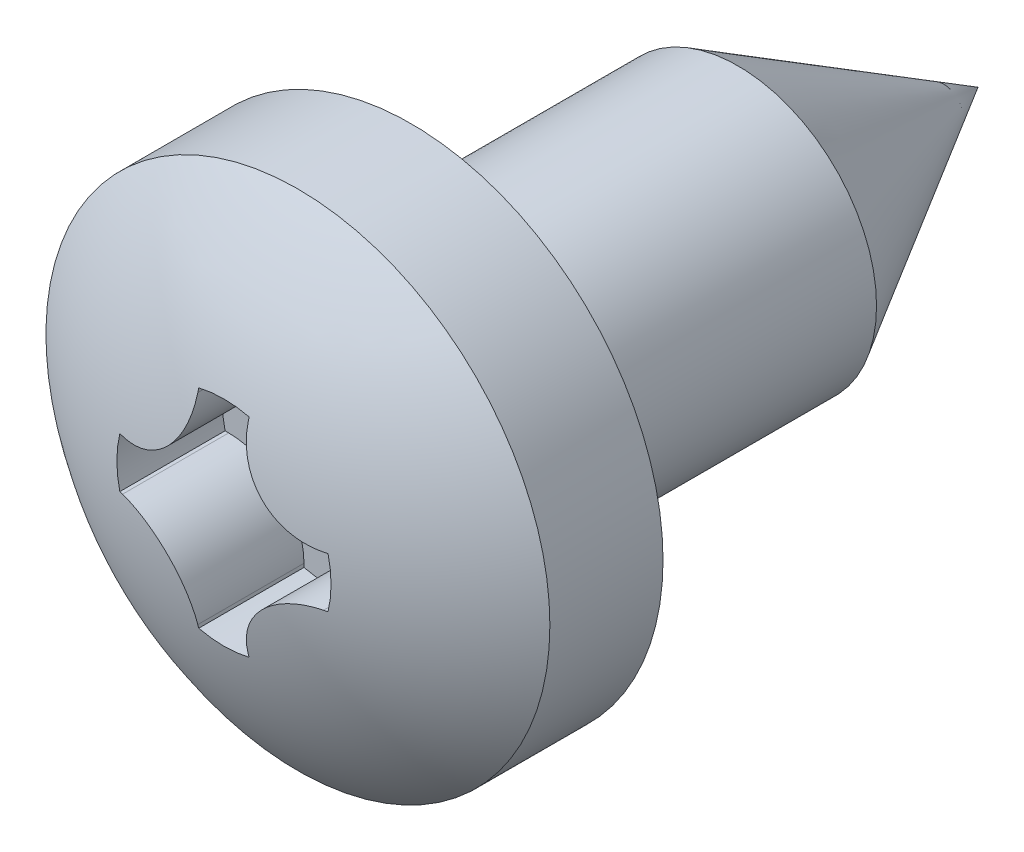
ISO-10303-21;
HEADER;
FILE_DESCRIPTION(('STEP AP214'),'2;1');
FILE_NAME('part.step','',(''),(''),'','','');
FILE_SCHEMA(('AUTOMOTIVE_DESIGN { 1 0 10303 214 1 1 1 1 }'));
ENDSEC;
DATA;
#1=APPLICATION_CONTEXT('core data for automotive mechanical design processes');
#2=APPLICATION_PROTOCOL_DEFINITION('international standard','automotive_design',2000,#1);
#3=PRODUCT_CONTEXT('',#1,'mechanical');
#4=PRODUCT('Part','Part','',(#3));
#5=PRODUCT_RELATED_PRODUCT_CATEGORY('part','',(#4));
#6=PRODUCT_DEFINITION_FORMATION('','',#4);
#7=PRODUCT_DEFINITION_CONTEXT('part definition',#1,'design');
#8=PRODUCT_DEFINITION('design','',#6,#7);
#9=PRODUCT_DEFINITION_SHAPE('','',#8);
#10=(LENGTH_UNIT() NAMED_UNIT(*) SI_UNIT(.MILLI.,.METRE.));
#11=(NAMED_UNIT(*) PLANE_ANGLE_UNIT() SI_UNIT($,.RADIAN.));
#12=(NAMED_UNIT(*) SI_UNIT($,.STERADIAN.) SOLID_ANGLE_UNIT());
#13=UNCERTAINTY_MEASURE_WITH_UNIT(LENGTH_MEASURE(1.E-05),#10,'distance_accuracy_value','');
#14=(GEOMETRIC_REPRESENTATION_CONTEXT(3) GLOBAL_UNCERTAINTY_ASSIGNED_CONTEXT((#13)) GLOBAL_UNIT_ASSIGNED_CONTEXT((#10,
#11,#12)) REPRESENTATION_CONTEXT('',''));
#15=CARTESIAN_POINT('',(0.,0.,0.));
#16=DIRECTION('',(0.,0.,1.));
#17=DIRECTION('',(1.,0.,0.));
#18=AXIS2_PLACEMENT_3D('',#15,#16,#17);
#19=CARTESIAN_POINT('',(0.,0.,2.9));
#20=DIRECTION('',(0.,0.,1.));
#21=DIRECTION('',(0.,1.,0.));
#22=AXIS2_PLACEMENT_3D('',#19,#20,#21);
#23=SPHERICAL_SURFACE('',#22,3.2);
#24=CARTESIAN_POINT('',(0.,0.,5.39799919935936));
#25=DIRECTION('',(0.,0.,1.));
#26=DIRECTION('',(1.,0.,0.));
#27=AXIS2_PLACEMENT_3D('',#24,#25,#26);
#28=CIRCLE('',#27,2.);
#29=CARTESIAN_POINT('',(2.,0.,5.39799919935936));
#30=VERTEX_POINT('',#29);
#31=EDGE_CURVE('E190',#30,#30,#28,.T.);
#32=ORIENTED_EDGE('',*,*,#31,.T.);
#33=EDGE_LOOP('',(#32));
#34=FACE_BOUND('',#33,.T.);
#35=CARTESIAN_POINT('',(0.,0.,5.98504457018047));
#36=DIRECTION('',(0.,0.,-1.));
#37=DIRECTION('',(-1.,0.,0.));
#38=AXIS2_PLACEMENT_3D('',#35,#36,#37);
#39=CIRCLE('',#38,0.85);
#40=CARTESIAN_POINT('',(0.200000000000001,0.826135582092915,5.98504457018047));
#41=VERTEX_POINT('',#40);
#42=CARTESIAN_POINT('',(-0.199999999999999,0.826135582092915,5.98504457018047));
#43=VERTEX_POINT('',#42);
#44=EDGE_CURVE('E298',#41,#43,#39,.F.);
#45=ORIENTED_EDGE('',*,*,#44,.F.);
#46=CARTESIAN_POINT('',(0.199999999999995,0.,2.9));
#47=DIRECTION('',(-1.,0.,0.));
#48=DIRECTION('',(0.,-1.,0.));
#49=AXIS2_PLACEMENT_3D('',#46,#47,#48);
#50=CIRCLE('',#49,3.19374388453426);
#51=CARTESIAN_POINT('',(0.200000000000001,0.797500009462237,5.99257073240172));
#52=VERTEX_POINT('',#51);
#53=EDGE_CURVE('E176',#52,#41,#50,.T.);
#54=ORIENTED_EDGE('',*,*,#53,.F.);
#55=CARTESIAN_POINT('',(0.200000033472805,0.797700009462237,5.9925191481242));
#56=CARTESIAN_POINT('',(0.199958585943166,0.765584612577376,6.00081150693265));
#57=CARTESIAN_POINT('',(0.202567151381046,0.733275599423227,6.00843748519532));
#58=CARTESIAN_POINT('',(0.213049468721375,0.669163190503092,6.02216667890958));
#59=CARTESIAN_POINT('',(0.220928138605759,0.637360295445592,6.02826846469623));
#60=CARTESIAN_POINT('',(0.241934580052925,0.575160718571951,6.03875243084097));
#61=CARTESIAN_POINT('',(0.255071740839946,0.544766661186098,6.0431315073583));
#62=CARTESIAN_POINT('',(0.286291958936198,0.486428822054425,6.05000453295774));
#63=CARTESIAN_POINT('',(0.304370880784494,0.458483017221231,6.05250005173667));
#64=CARTESIAN_POINT('',(0.344333915217269,0.406755748257839,6.05547466759342));
#65=CARTESIAN_POINT('',(0.366078643749459,0.382870071363386,6.05601539962287));
#66=CARTESIAN_POINT('',(0.413114828149669,0.338926235328101,6.05523389232351));
#67=CARTESIAN_POINT('',(0.438406302053391,0.31886809565206,6.05391164352087));
#68=CARTESIAN_POINT('',(0.491337848312659,0.283428579732002,6.04948543959879));
#69=CARTESIAN_POINT('',(0.518933539669598,0.26797709060594,6.04641052005074));
#70=CARTESIAN_POINT('',(0.576026048301452,0.241672932796324,6.03859706761581));
#71=CARTESIAN_POINT('',(0.605523455084,0.230821698106915,6.03385801682534));
#72=CARTESIAN_POINT('',(0.662128765637274,0.214882325318074,6.02349118330749));
#73=CARTESIAN_POINT('',(0.689123366977149,0.209276438333222,6.01802737287753));
#74=CARTESIAN_POINT('',(0.743355328975026,0.201826686889872,6.00603874154387));
#75=CARTESIAN_POINT('',(0.770592289914182,0.199977484994576,5.99951544020863));
#76=CARTESIAN_POINT('',(0.797700009462238,0.200000033472804,5.9925191481242));
#77=B_SPLINE_CURVE_WITH_KNOTS('',3,(#55,#56,#57,#58,#59,#60,#61,#62,#63,#64,#65,#66,#67,#68,#69,
#70,#71,#72,#73,#74,#75,#76),.UNSPECIFIED.,.F.,.F.,(4,2,2,2,2,2,2,2,2,2,4),(0.,
0.0994256874660207,0.198944287163754,0.298641379250357,0.398255294950895,0.494699541070248,
0.591144277639977,0.686035864871707,0.780957010056294,0.865005724605283,0.948934940362168),.UNSPECIFIED.);
#78=CARTESIAN_POINT('',(0.797500009462238,0.2,5.99257073240172));
#79=VERTEX_POINT('',#78);
#80=EDGE_CURVE('E288',#52,#79,#77,.T.);
#81=ORIENTED_EDGE('',*,*,#80,.T.);
#82=CARTESIAN_POINT('',(0.,0.200000000000042,2.9));
#83=DIRECTION('',(0.,1.,0.));
#84=DIRECTION('',(-1.,0.,0.));
#85=AXIS2_PLACEMENT_3D('',#82,#83,#84);
#86=CIRCLE('',#85,3.19374388453426);
#87=CARTESIAN_POINT('',(0.826135582092917,0.199999999999999,5.98504457018047));
#88=VERTEX_POINT('',#87);
#89=EDGE_CURVE('E296',#79,#88,#86,.T.);
#90=ORIENTED_EDGE('',*,*,#89,.T.);
#91=CARTESIAN_POINT('',(0.,0.,5.98504457018047));
#92=DIRECTION('',(0.,0.,-1.));
#93=DIRECTION('',(-1.,0.,0.));
#94=AXIS2_PLACEMENT_3D('',#91,#92,#93);
#95=CIRCLE('',#94,0.850000000000002);
#96=CARTESIAN_POINT('',(0.826135582092917,-0.199999999999999,5.98504457018047));
#97=VERTEX_POINT('',#96);
#98=EDGE_CURVE('E371',#88,#97,#95,.T.);
#99=ORIENTED_EDGE('',*,*,#98,.T.);
#100=CARTESIAN_POINT('',(0.,-0.200000000000042,2.9));
#101=DIRECTION('',(0.,1.,0.));
#102=DIRECTION('',(-1.,0.,0.));
#103=AXIS2_PLACEMENT_3D('',#100,#101,#102);
#104=CIRCLE('',#103,3.19374388453426);
#105=CARTESIAN_POINT('',(0.797500009462238,-0.2,5.99257073240172));
#106=VERTEX_POINT('',#105);
#107=EDGE_CURVE('E260',#106,#97,#104,.T.);
#108=ORIENTED_EDGE('',*,*,#107,.F.);
#109=CARTESIAN_POINT('',(0.200000033472805,-0.797700009462237,5.9925191481242));
#110=CARTESIAN_POINT('',(0.199958585943166,-0.765584612577376,6.00081150693265));
#111=CARTESIAN_POINT('',(0.202567151381046,-0.733275599423227,6.00843748519532));
#112=CARTESIAN_POINT('',(0.213049468721375,-0.669163190503092,6.02216667890958));
#113=CARTESIAN_POINT('',(0.220928138605759,-0.637360295445592,6.02826846469623));
#114=CARTESIAN_POINT('',(0.241934580052925,-0.575160718571951,6.03875243084097));
#115=CARTESIAN_POINT('',(0.255071740839946,-0.544766661186098,6.0431315073583));
#116=CARTESIAN_POINT('',(0.286291958936198,-0.486428822054425,6.05000453295774));
#117=CARTESIAN_POINT('',(0.304370880784494,-0.458483017221231,6.05250005173667));
#118=CARTESIAN_POINT('',(0.344333915217269,-0.406755748257839,6.05547466759342));
#119=CARTESIAN_POINT('',(0.366078643749459,-0.382870071363386,6.05601539962287));
#120=CARTESIAN_POINT('',(0.413114828149669,-0.338926235328101,6.05523389232351));
#121=CARTESIAN_POINT('',(0.438406302053391,-0.31886809565206,6.05391164352087));
#122=CARTESIAN_POINT('',(0.491337848312659,-0.283428579732002,6.04948543959879));
#123=CARTESIAN_POINT('',(0.518933539669598,-0.26797709060594,6.04641052005074));
#124=CARTESIAN_POINT('',(0.576026048301452,-0.241672932796324,6.03859706761581));
#125=CARTESIAN_POINT('',(0.605523455084,-0.230821698106915,6.03385801682534));
#126=CARTESIAN_POINT('',(0.662128765637274,-0.214882325318074,6.02349118330749));
#127=CARTESIAN_POINT('',(0.689123366977148,-0.209276438333222,6.01802737287753));
#128=CARTESIAN_POINT('',(0.743355328975026,-0.201826686889872,6.00603874154387));
#129=CARTESIAN_POINT('',(0.770592289914182,-0.199977484994576,5.99951544020863));
#130=CARTESIAN_POINT('',(0.797700009462238,-0.200000033472804,5.9925191481242));
#131=B_SPLINE_CURVE_WITH_KNOTS('',3,(#109,#110,#111,#112,#113,#114,#115,#116,#117,#118,#119,
#120,#121,#122,#123,#124,#125,#126,#127,#128,#129,#130),.UNSPECIFIED.,.F.,.F.,(4,2,2,2,2,2,2,2,
2,2,4),(0.,0.0994256874660205,0.198944287163754,0.298641379250357,0.398255294950895,
0.494699541070248,0.591144277639977,0.686035864871707,0.780957010056294,0.865005724605282,
0.948934940362168),.UNSPECIFIED.);
#132=CARTESIAN_POINT('',(0.200000000000001,-0.797500009462237,5.99257073240172));
#133=VERTEX_POINT('',#132);
#134=EDGE_CURVE('E253',#133,#106,#131,.T.);
#135=ORIENTED_EDGE('',*,*,#134,.F.);
#136=CARTESIAN_POINT('',(0.199999999999995,0.,2.9));
#137=DIRECTION('',(1.,0.,0.));
#138=DIRECTION('',(0.,1.,0.));
#139=AXIS2_PLACEMENT_3D('',#136,#137,#138);
#140=CIRCLE('',#139,3.19374388453426);
#141=CARTESIAN_POINT('',(0.200000000000001,-0.826135582092915,5.98504457018047));
#142=VERTEX_POINT('',#141);
#143=EDGE_CURVE('E250',#133,#142,#140,.T.);
#144=ORIENTED_EDGE('',*,*,#143,.T.);
#145=CARTESIAN_POINT('',(0.,0.,5.98504457018047));
#146=DIRECTION('',(0.,0.,-1.));
#147=DIRECTION('',(-1.,0.,0.));
#148=AXIS2_PLACEMENT_3D('',#145,#146,#147);
#149=CIRCLE('',#148,0.85);
#150=CARTESIAN_POINT('',(-0.199999999999999,-0.826135582092915,5.98504457018047));
#151=VERTEX_POINT('',#150);
#152=EDGE_CURVE('E247',#142,#151,#149,.T.);
#153=ORIENTED_EDGE('',*,*,#152,.T.);
#154=CARTESIAN_POINT('',(-0.200000000000009,0.,2.9));
#155=DIRECTION('',(1.,0.,0.));
#156=DIRECTION('',(0.,1.,0.));
#157=AXIS2_PLACEMENT_3D('',#154,#155,#156);
#158=CIRCLE('',#157,3.19374388453426);
#159=CARTESIAN_POINT('',(-0.2,-0.797500009462236,5.99257073240172));
#160=VERTEX_POINT('',#159);
#161=EDGE_CURVE('E244',#160,#151,#158,.T.);
#162=ORIENTED_EDGE('',*,*,#161,.F.);
#163=CARTESIAN_POINT('',(-0.200000033472803,-0.797700009462236,5.9925191481242));
#164=CARTESIAN_POINT('',(-0.199958585943164,-0.765584612577375,6.00081150693265));
#165=CARTESIAN_POINT('',(-0.202567151381045,-0.733275599423226,6.00843748519532));
#166=CARTESIAN_POINT('',(-0.213049468721374,-0.669163190503091,6.02216667890959));
#167=CARTESIAN_POINT('',(-0.220928138605758,-0.637360295445591,6.02826846469623));
#168=CARTESIAN_POINT('',(-0.241934580052924,-0.57516071857195,6.03875243084097));
#169=CARTESIAN_POINT('',(-0.255071740839945,-0.544766661186096,6.0431315073583));
#170=CARTESIAN_POINT('',(-0.286291958936197,-0.486428822054424,6.05000453295774));
#171=CARTESIAN_POINT('',(-0.304370880784493,-0.45848301722123,6.05250005173667));
#172=CARTESIAN_POINT('',(-0.344333915217268,-0.406755748257838,6.05547466759342));
#173=CARTESIAN_POINT('',(-0.366078643749458,-0.382870071363384,6.05601539962287));
#174=CARTESIAN_POINT('',(-0.413114828149668,-0.3389262353281,6.05523389232351));
#175=CARTESIAN_POINT('',(-0.43840630205339,-0.318868095652059,6.05391164352087));
#176=CARTESIAN_POINT('',(-0.491337848312658,-0.283428579732001,6.04948543959879));
#177=CARTESIAN_POINT('',(-0.518933539669597,-0.267977090605939,6.04641052005074));
#178=CARTESIAN_POINT('',(-0.57602604830145,-0.241672932796323,6.03859706761581));
#179=CARTESIAN_POINT('',(-0.605523455083999,-0.230821698106914,6.03385801682534));
#180=CARTESIAN_POINT('',(-0.662128765637273,-0.214882325318074,6.02349118330749));
#181=CARTESIAN_POINT('',(-0.689123366977147,-0.209276438333221,6.01802737287753));
#182=CARTESIAN_POINT('',(-0.743355328975024,-0.201826686889871,6.00603874154387));
#183=CARTESIAN_POINT('',(-0.77059228991418,-0.199977484994575,5.99951544020863));
#184=CARTESIAN_POINT('',(-0.797700009462236,-0.200000033472803,5.9925191481242));
#185=B_SPLINE_CURVE_WITH_KNOTS('',3,(#163,#164,#165,#166,#167,#168,#169,#170,#171,#172,#173,
#174,#175,#176,#177,#178,#179,#180,#181,#182,#183,#184),.UNSPECIFIED.,.F.,.F.,(4,2,2,2,2,2,2,2,
2,2,4),(0.,0.0994256874660207,0.198944287163754,0.298641379250357,0.398255294950895,
0.494699541070248,0.591144277639977,0.686035864871707,0.780957010056294,0.865005724605282,
0.948934940362167),.UNSPECIFIED.);
#186=CARTESIAN_POINT('',(-0.797500009462236,-0.199999999999999,5.99257073240172));
#187=VERTEX_POINT('',#186);
#188=EDGE_CURVE('E236',#160,#187,#185,.T.);
#189=ORIENTED_EDGE('',*,*,#188,.T.);
#190=CARTESIAN_POINT('',(0.,-0.200000000000012,2.9));
#191=DIRECTION('',(0.,-1.,0.));
#192=DIRECTION('',(1.,0.,0.));
#193=AXIS2_PLACEMENT_3D('',#190,#191,#192);
#194=CIRCLE('',#193,3.19374388453426);
#195=CARTESIAN_POINT('',(-0.826135582092915,-0.199999999999999,5.98504457018047));
#196=VERTEX_POINT('',#195);
#197=EDGE_CURVE('E245',#187,#196,#194,.T.);
#198=ORIENTED_EDGE('',*,*,#197,.T.);
#199=CARTESIAN_POINT('',(0.,0.,5.98504457018047));
#200=DIRECTION('',(0.,0.,-1.));
#201=DIRECTION('',(-1.,0.,0.));
#202=AXIS2_PLACEMENT_3D('',#199,#200,#201);
#203=CIRCLE('',#202,0.85);
#204=CARTESIAN_POINT('',(-0.826135582092915,0.199999999999999,5.98504457018047));
#205=VERTEX_POINT('',#204);
#206=EDGE_CURVE('E410',#205,#196,#203,.F.);
#207=ORIENTED_EDGE('',*,*,#206,.F.);
#208=CARTESIAN_POINT('',(0.,0.200000000000012,2.9));
#209=DIRECTION('',(0.,-1.,0.));
#210=DIRECTION('',(1.,0.,0.));
#211=AXIS2_PLACEMENT_3D('',#208,#209,#210);
#212=CIRCLE('',#211,3.19374388453426);
#213=CARTESIAN_POINT('',(-0.797500009462236,0.199999999999999,5.99257073240172));
#214=VERTEX_POINT('',#213);
#215=EDGE_CURVE('E204',#214,#205,#212,.T.);
#216=ORIENTED_EDGE('',*,*,#215,.F.);
#217=CARTESIAN_POINT('',(-0.200000033472804,0.797700009462236,5.9925191481242));
#218=CARTESIAN_POINT('',(-0.199958585943164,0.765584612577375,6.00081150693265));
#219=CARTESIAN_POINT('',(-0.202567151381045,0.733275599423226,6.00843748519532));
#220=CARTESIAN_POINT('',(-0.213049468721374,0.669163190503091,6.02216667890958));
#221=CARTESIAN_POINT('',(-0.220928138605758,0.637360295445591,6.02826846469623));
#222=CARTESIAN_POINT('',(-0.241934580052924,0.57516071857195,6.03875243084097));
#223=CARTESIAN_POINT('',(-0.255071740839945,0.544766661186096,6.0431315073583));
#224=CARTESIAN_POINT('',(-0.286291958936197,0.486428822054424,6.05000453295774));
#225=CARTESIAN_POINT('',(-0.304370880784493,0.45848301722123,6.05250005173667));
#226=CARTESIAN_POINT('',(-0.344333915217268,0.406755748257838,6.05547466759342));
#227=CARTESIAN_POINT('',(-0.366078643749458,0.382870071363384,6.05601539962287));
#228=CARTESIAN_POINT('',(-0.413114828149668,0.3389262353281,6.05523389232351));
#229=CARTESIAN_POINT('',(-0.43840630205339,0.318868095652059,6.05391164352087));
#230=CARTESIAN_POINT('',(-0.491337848312658,0.283428579732001,6.04948543959879));
#231=CARTESIAN_POINT('',(-0.518933539669597,0.267977090605939,6.04641052005074));
#232=CARTESIAN_POINT('',(-0.57602604830145,0.241672932796323,6.03859706761581));
#233=CARTESIAN_POINT('',(-0.605523455083999,0.230821698106914,6.03385801682534));
#234=CARTESIAN_POINT('',(-0.662128765637273,0.214882325318074,6.02349118330749));
#235=CARTESIAN_POINT('',(-0.689123366977147,0.209276438333221,6.01802737287753));
#236=CARTESIAN_POINT('',(-0.743355328975024,0.201826686889871,6.00603874154387));
#237=CARTESIAN_POINT('',(-0.77059228991418,0.199977484994575,5.99951544020863));
#238=CARTESIAN_POINT('',(-0.797700009462236,0.200000033472803,5.9925191481242));
#239=B_SPLINE_CURVE_WITH_KNOTS('',3,(#217,#218,#219,#220,#221,#222,#223,#224,#225,#226,#227,
#228,#229,#230,#231,#232,#233,#234,#235,#236,#237,#238),.UNSPECIFIED.,.F.,.F.,(4,2,2,2,2,2,2,2,
2,2,4),(0.,0.0994256874660207,0.198944287163754,0.298641379250357,0.398255294950895,
0.494699541070248,0.591144277639977,0.686035864871707,0.780957010056294,0.865005724605282,
0.948934940362167),.UNSPECIFIED.);
#240=CARTESIAN_POINT('',(-0.2,0.797500009462236,5.99257073240172));
#241=VERTEX_POINT('',#240);
#242=EDGE_CURVE('E196',#241,#214,#239,.T.);
#243=ORIENTED_EDGE('',*,*,#242,.F.);
#244=CARTESIAN_POINT('',(-0.200000000000009,0.,2.9));
#245=DIRECTION('',(-1.,0.,0.));
#246=DIRECTION('',(0.,-1.,0.));
#247=AXIS2_PLACEMENT_3D('',#244,#245,#246);
#248=CIRCLE('',#247,3.19374388453426);
#249=EDGE_CURVE('E193',#241,#43,#248,.T.);
#250=ORIENTED_EDGE('',*,*,#249,.T.);
#251=EDGE_LOOP('',(#45,#54,#81,#90,#99,#108,#135,#144,#153,#162,#189,#198,#207,#216,#243,#250));
#252=FACE_BOUND('',#251,.T.);
#253=ADVANCED_FACE('F41',(#34,#252),#23,.T.);
#254=CARTESIAN_POINT('',(0.,0.,0.));
#255=DIRECTION('',(0.,0.,1.));
#256=DIRECTION('',(1.,0.,0.));
#257=AXIS2_PLACEMENT_3D('',#254,#255,#256);
#258=CONICAL_SURFACE('',#257,0.,0.523598775598293);
#259=CARTESIAN_POINT('',(0.,0.,1.90525588832579));
#260=DIRECTION('',(0.,0.,1.));
#261=DIRECTION('',(1.,0.,0.));
#262=AXIS2_PLACEMENT_3D('',#259,#260,#261);
#263=CIRCLE('',#262,1.1);
#264=CARTESIAN_POINT('',(1.1,0.,1.90525588832579));
#265=VERTEX_POINT('',#264);
#266=EDGE_CURVE('E177',#265,#265,#263,.T.);
#267=ORIENTED_EDGE('',*,*,#266,.F.);
#268=EDGE_LOOP('',(#267));
#269=FACE_BOUND('',#268,.T.);
#270=CARTESIAN_POINT('',(0.,0.,0.));
#271=VERTEX_POINT('',#270);
#272=VERTEX_LOOP('',#271);
#273=FACE_BOUND('',#272,.T.);
#274=ADVANCED_FACE('F312',(#269,#273),#258,.T.);
#275=CARTESIAN_POINT('',(0.,0.,11.71));
#276=DIRECTION('',(0.,0.,1.));
#277=DIRECTION('',(1.,0.,0.));
#278=AXIS2_PLACEMENT_3D('',#275,#276,#277);
#279=CYLINDRICAL_SURFACE('',#278,2.);
#280=ORIENTED_EDGE('',*,*,#31,.F.);
#281=EDGE_LOOP('',(#280));
#282=FACE_BOUND('',#281,.T.);
#283=CARTESIAN_POINT('',(0.,0.,4.5));
#284=DIRECTION('',(0.,0.,1.));
#285=DIRECTION('',(1.,0.,0.));
#286=AXIS2_PLACEMENT_3D('',#283,#284,#285);
#287=CIRCLE('',#286,2.);
#288=CARTESIAN_POINT('',(2.,0.,4.5));
#289=VERTEX_POINT('',#288);
#290=EDGE_CURVE('E181',#289,#289,#287,.T.);
#291=ORIENTED_EDGE('',*,*,#290,.T.);
#292=EDGE_LOOP('',(#291));
#293=FACE_BOUND('',#292,.T.);
#294=ADVANCED_FACE('F317',(#282,#293),#279,.T.);
#295=CARTESIAN_POINT('',(0.,2.,4.5));
#296=DIRECTION('',(0.,0.,1.));
#297=DIRECTION('',(1.,0.,0.));
#298=AXIS2_PLACEMENT_3D('',#295,#296,#297);
#299=PLANE('',#298);
#300=CARTESIAN_POINT('',(0.,0.,4.5));
#301=DIRECTION('',(0.,0.,1.));
#302=DIRECTION('',(1.,0.,0.));
#303=AXIS2_PLACEMENT_3D('',#300,#301,#302);
#304=CIRCLE('',#303,1.2);
#305=CARTESIAN_POINT('',(1.2,0.,4.5));
#306=VERTEX_POINT('',#305);
#307=EDGE_CURVE('E50',#306,#306,#304,.T.);
#308=ORIENTED_EDGE('',*,*,#307,.T.);
#309=EDGE_LOOP('',(#308));
#310=FACE_BOUND('',#309,.T.);
#311=ORIENTED_EDGE('',*,*,#290,.F.);
#312=EDGE_LOOP('',(#311));
#313=FACE_BOUND('',#312,.T.);
#314=ADVANCED_FACE('F302',(#310,#313),#299,.F.);
#315=CARTESIAN_POINT('',(0.,0.,11.71));
#316=DIRECTION('',(0.,0.,1.));
#317=DIRECTION('',(1.,0.,0.));
#318=AXIS2_PLACEMENT_3D('',#315,#316,#317);
#319=CYLINDRICAL_SURFACE('',#318,1.1);
#320=CARTESIAN_POINT('',(0.,0.,4.4));
#321=DIRECTION('',(0.,0.,1.));
#322=DIRECTION('',(1.,0.,0.));
#323=AXIS2_PLACEMENT_3D('',#320,#321,#322);
#324=CIRCLE('',#323,1.1);
#325=CARTESIAN_POINT('',(1.1,0.,4.4));
#326=VERTEX_POINT('',#325);
#327=EDGE_CURVE('E11',#326,#326,#324,.F.);
#328=ORIENTED_EDGE('',*,*,#327,.T.);
#329=EDGE_LOOP('',(#328));
#330=FACE_BOUND('',#329,.T.);
#331=ORIENTED_EDGE('',*,*,#266,.T.);
#332=EDGE_LOOP('',(#331));
#333=FACE_BOUND('',#332,.T.);
#334=ADVANCED_FACE('F464',(#330,#333),#319,.T.);
#335=CARTESIAN_POINT('',(0.,0.,5.15));
#336=DIRECTION('',(0.,0.,1.));
#337=DIRECTION('',(1.,0.,0.));
#338=AXIS2_PLACEMENT_3D('',#335,#336,#337);
#339=CYLINDRICAL_SURFACE('',#338,0.85);
#340=ORIENTED_EDGE('',*,*,#44,.T.);
#341=DIRECTION('',(0.,0.,1.));
#342=VECTOR('',#341,1.);
#343=CARTESIAN_POINT('',(-0.199999999999999,0.826135582092915,5.15));
#344=LINE('',#343,#342);
#345=CARTESIAN_POINT('',(-0.199999999999999,0.826135582092915,5.15));
#346=VERTEX_POINT('',#345);
#347=EDGE_CURVE('E57',#346,#43,#344,.T.);
#348=ORIENTED_EDGE('',*,*,#347,.F.);
#349=CARTESIAN_POINT('',(0.,0.,5.15));
#350=DIRECTION('',(0.,0.,-1.));
#351=DIRECTION('',(-1.,0.,0.));
#352=AXIS2_PLACEMENT_3D('',#349,#350,#351);
#353=CIRCLE('',#352,0.85);
#354=CARTESIAN_POINT('',(0.200000000000001,0.826135582092915,5.15));
#355=VERTEX_POINT('',#354);
#356=EDGE_CURVE('E159',#346,#355,#353,.T.);
#357=ORIENTED_EDGE('',*,*,#356,.T.);
#358=DIRECTION('',(0.,0.,1.));
#359=VECTOR('',#358,1.);
#360=CARTESIAN_POINT('',(0.200000000000001,0.826135582092915,5.15));
#361=LINE('',#360,#359);
#362=EDGE_CURVE('E171',#355,#41,#361,.T.);
#363=ORIENTED_EDGE('',*,*,#362,.T.);
#364=EDGE_LOOP('',(#340,#348,#357,#363));
#365=FACE_BOUND('',#364,.T.);
#366=ADVANCED_FACE('F170',(#365),#339,.F.);
#367=CARTESIAN_POINT('',(0.200000000000001,0.826135582092915,5.15));
#368=DIRECTION('',(-1.,0.,0.));
#369=DIRECTION('',(0.,-1.,0.));
#370=AXIS2_PLACEMENT_3D('',#367,#368,#369);
#371=PLANE('',#370);
#372=ORIENTED_EDGE('',*,*,#53,.T.);
#373=ORIENTED_EDGE('',*,*,#362,.F.);
#374=DIRECTION('',(0.,-1.,0.));
#375=VECTOR('',#374,1.);
#376=CARTESIAN_POINT('',(0.200000000000001,0.826135582092915,5.15));
#377=LINE('',#376,#375);
#378=CARTESIAN_POINT('',(0.200000000000001,0.797500009462237,5.15));
#379=VERTEX_POINT('',#378);
#380=EDGE_CURVE('E155',#355,#379,#377,.T.);
#381=ORIENTED_EDGE('',*,*,#380,.T.);
#382=DIRECTION('',(0.,0.,1.));
#383=VECTOR('',#382,1.);
#384=CARTESIAN_POINT('',(0.200000000000001,0.797500009462237,5.15));
#385=LINE('',#384,#383);
#386=EDGE_CURVE('E178',#379,#52,#385,.T.);
#387=ORIENTED_EDGE('',*,*,#386,.T.);
#388=EDGE_LOOP('',(#372,#373,#381,#387));
#389=FACE_BOUND('',#388,.T.);
#390=ADVANCED_FACE('F174',(#389),#371,.T.);
#391=CARTESIAN_POINT('',(0.797500009462238,0.797500009462237,5.15));
#392=DIRECTION('',(0.,0.,1.));
#393=DIRECTION('',(1.,0.,0.));
#394=AXIS2_PLACEMENT_3D('',#391,#392,#393);
#395=CYLINDRICAL_SURFACE('',#394,0.597500009462237);
#396=ORIENTED_EDGE('',*,*,#386,.F.);
#397=CARTESIAN_POINT('',(0.797500009462238,0.797500009462237,5.15));
#398=DIRECTION('',(0.,0.,-1.));
#399=DIRECTION('',(-1.,0.,0.));
#400=AXIS2_PLACEMENT_3D('',#397,#398,#399);
#401=CIRCLE('',#400,0.597500009462237);
#402=CARTESIAN_POINT('',(0.797500009462238,0.2,5.15));
#403=VERTEX_POINT('',#402);
#404=EDGE_CURVE('E162',#403,#379,#401,.T.);
#405=ORIENTED_EDGE('',*,*,#404,.F.);
#406=DIRECTION('',(0.,0.,1.));
#407=VECTOR('',#406,1.);
#408=CARTESIAN_POINT('',(0.797500009462238,0.2,5.15));
#409=LINE('',#408,#407);
#410=EDGE_CURVE('E183',#403,#79,#409,.T.);
#411=ORIENTED_EDGE('',*,*,#410,.T.);
#412=ORIENTED_EDGE('',*,*,#80,.F.);
#413=EDGE_LOOP('',(#396,#405,#411,#412));
#414=FACE_BOUND('',#413,.T.);
#415=ADVANCED_FACE('F280',(#414),#395,.T.);
#416=CARTESIAN_POINT('',(0.826135582092917,0.199999999999999,5.15));
#417=DIRECTION('',(0.,1.,0.));
#418=DIRECTION('',(-1.,0.,0.));
#419=AXIS2_PLACEMENT_3D('',#416,#417,#418);
#420=PLANE('',#419);
#421=ORIENTED_EDGE('',*,*,#410,.F.);
#422=DIRECTION('',(-1.,0.,0.));
#423=VECTOR('',#422,1.);
#424=CARTESIAN_POINT('',(0.826135582092917,0.199999999999999,5.15));
#425=LINE('',#424,#423);
#426=CARTESIAN_POINT('',(0.826135582092917,0.199999999999999,5.15));
#427=VERTEX_POINT('',#426);
#428=EDGE_CURVE('E379',#427,#403,#425,.T.);
#429=ORIENTED_EDGE('',*,*,#428,.F.);
#430=DIRECTION('',(0.,0.,1.));
#431=VECTOR('',#430,1.);
#432=CARTESIAN_POINT('',(0.826135582092917,0.199999999999999,5.15));
#433=LINE('',#432,#431);
#434=EDGE_CURVE('E364',#427,#88,#433,.T.);
#435=ORIENTED_EDGE('',*,*,#434,.T.);
#436=ORIENTED_EDGE('',*,*,#89,.F.);
#437=EDGE_LOOP('',(#421,#429,#435,#436));
#438=FACE_BOUND('',#437,.T.);
#439=ADVANCED_FACE('F276',(#438),#420,.F.);
#440=CARTESIAN_POINT('',(0.,0.,5.15));
#441=DIRECTION('',(0.,0.,1.));
#442=DIRECTION('',(1.,0.,0.));
#443=AXIS2_PLACEMENT_3D('',#440,#441,#442);
#444=CYLINDRICAL_SURFACE('',#443,0.850000000000002);
#445=ORIENTED_EDGE('',*,*,#434,.F.);
#446=CARTESIAN_POINT('',(0.,0.,5.15));
#447=DIRECTION('',(0.,0.,1.));
#448=DIRECTION('',(1.,0.,0.));
#449=AXIS2_PLACEMENT_3D('',#446,#447,#448);
#450=CIRCLE('',#449,0.850000000000002);
#451=CARTESIAN_POINT('',(0.826135582092917,-0.199999999999999,5.15));
#452=VERTEX_POINT('',#451);
#453=EDGE_CURVE('E377',#452,#427,#450,.T.);
#454=ORIENTED_EDGE('',*,*,#453,.F.);
#455=DIRECTION('',(0.,0.,1.));
#456=VECTOR('',#455,1.);
#457=CARTESIAN_POINT('',(0.826135582092917,-0.199999999999999,5.15));
#458=LINE('',#457,#456);
#459=EDGE_CURVE('E361',#452,#97,#458,.T.);
#460=ORIENTED_EDGE('',*,*,#459,.T.);
#461=ORIENTED_EDGE('',*,*,#98,.F.);
#462=EDGE_LOOP('',(#445,#454,#460,#461));
#463=FACE_BOUND('',#462,.T.);
#464=ADVANCED_FACE('F272',(#463),#444,.F.);
#465=CARTESIAN_POINT('',(0.826135582092917,-0.199999999999999,5.15));
#466=DIRECTION('',(0.,1.,0.));
#467=DIRECTION('',(-1.,0.,0.));
#468=AXIS2_PLACEMENT_3D('',#465,#466,#467);
#469=PLANE('',#468);
#470=ORIENTED_EDGE('',*,*,#107,.T.);
#471=ORIENTED_EDGE('',*,*,#459,.F.);
#472=DIRECTION('',(-1.,0.,0.));
#473=VECTOR('',#472,1.);
#474=CARTESIAN_POINT('',(0.826135582092917,-0.199999999999999,5.15));
#475=LINE('',#474,#473);
#476=CARTESIAN_POINT('',(0.797500009462238,-0.2,5.15));
#477=VERTEX_POINT('',#476);
#478=EDGE_CURVE('E378',#452,#477,#475,.T.);
#479=ORIENTED_EDGE('',*,*,#478,.T.);
#480=DIRECTION('',(0.,0.,1.));
#481=VECTOR('',#480,1.);
#482=CARTESIAN_POINT('',(0.797500009462238,-0.2,5.15));
#483=LINE('',#482,#481);
#484=EDGE_CURVE('E358',#477,#106,#483,.T.);
#485=ORIENTED_EDGE('',*,*,#484,.T.);
#486=EDGE_LOOP('',(#470,#471,#479,#485));
#487=FACE_BOUND('',#486,.T.);
#488=ADVANCED_FACE('F268',(#487),#469,.T.);
#489=CARTESIAN_POINT('',(0.797500009462238,-0.797500009462237,5.15));
#490=DIRECTION('',(0.,0.,1.));
#491=DIRECTION('',(1.,0.,0.));
#492=AXIS2_PLACEMENT_3D('',#489,#490,#491);
#493=CYLINDRICAL_SURFACE('',#492,0.597500009462237);
#494=ORIENTED_EDGE('',*,*,#134,.T.);
#495=ORIENTED_EDGE('',*,*,#484,.F.);
#496=CARTESIAN_POINT('',(0.797500009462238,-0.797500009462237,5.15));
#497=DIRECTION('',(0.,0.,1.));
#498=DIRECTION('',(1.,0.,0.));
#499=AXIS2_PLACEMENT_3D('',#496,#497,#498);
#500=CIRCLE('',#499,0.597500009462237);
#501=CARTESIAN_POINT('',(0.200000000000001,-0.797500009462237,5.15));
#502=VERTEX_POINT('',#501);
#503=EDGE_CURVE('E381',#477,#502,#500,.T.);
#504=ORIENTED_EDGE('',*,*,#503,.T.);
#505=DIRECTION('',(0.,0.,1.));
#506=VECTOR('',#505,1.);
#507=CARTESIAN_POINT('',(0.200000000000001,-0.797500009462237,5.15));
#508=LINE('',#507,#506);
#509=EDGE_CURVE('E355',#502,#133,#508,.T.);
#510=ORIENTED_EDGE('',*,*,#509,.T.);
#511=EDGE_LOOP('',(#494,#495,#504,#510));
#512=FACE_BOUND('',#511,.T.);
#513=ADVANCED_FACE('F262',(#512),#493,.T.);
#514=CARTESIAN_POINT('',(0.200000000000001,-0.826135582092915,5.15));
#515=DIRECTION('',(1.,0.,0.));
#516=DIRECTION('',(0.,1.,0.));
#517=AXIS2_PLACEMENT_3D('',#514,#515,#516);
#518=PLANE('',#517);
#519=ORIENTED_EDGE('',*,*,#509,.F.);
#520=DIRECTION('',(0.,1.,0.));
#521=VECTOR('',#520,1.);
#522=CARTESIAN_POINT('',(0.200000000000001,-0.826135582092915,5.15));
#523=LINE('',#522,#521);
#524=CARTESIAN_POINT('',(0.200000000000001,-0.826135582092915,5.15));
#525=VERTEX_POINT('',#524);
#526=EDGE_CURVE('E387',#525,#502,#523,.T.);
#527=ORIENTED_EDGE('',*,*,#526,.F.);
#528=DIRECTION('',(0.,0.,1.));
#529=VECTOR('',#528,1.);
#530=CARTESIAN_POINT('',(0.200000000000001,-0.826135582092915,5.15));
#531=LINE('',#530,#529);
#532=EDGE_CURVE('E352',#525,#142,#531,.T.);
#533=ORIENTED_EDGE('',*,*,#532,.T.);
#534=ORIENTED_EDGE('',*,*,#143,.F.);
#535=EDGE_LOOP('',(#519,#527,#533,#534));
#536=FACE_BOUND('',#535,.T.);
#537=ADVANCED_FACE('F267',(#536),#518,.F.);
#538=CARTESIAN_POINT('',(0.,0.,5.15));
#539=DIRECTION('',(0.,0.,1.));
#540=DIRECTION('',(1.,0.,0.));
#541=AXIS2_PLACEMENT_3D('',#538,#539,#540);
#542=CYLINDRICAL_SURFACE('',#541,0.85);
#543=ORIENTED_EDGE('',*,*,#532,.F.);
#544=CARTESIAN_POINT('',(0.,0.,5.15));
#545=DIRECTION('',(0.,0.,1.));
#546=DIRECTION('',(1.,0.,0.));
#547=AXIS2_PLACEMENT_3D('',#544,#545,#546);
#548=CIRCLE('',#547,0.85);
#549=CARTESIAN_POINT('',(-0.199999999999999,-0.826135582092915,5.15));
#550=VERTEX_POINT('',#549);
#551=EDGE_CURVE('E390',#550,#525,#548,.T.);
#552=ORIENTED_EDGE('',*,*,#551,.F.);
#553=DIRECTION('',(0.,0.,1.));
#554=VECTOR('',#553,1.);
#555=CARTESIAN_POINT('',(-0.199999999999999,-0.826135582092915,5.15));
#556=LINE('',#555,#554);
#557=EDGE_CURVE('E349',#550,#151,#556,.T.);
#558=ORIENTED_EDGE('',*,*,#557,.T.);
#559=ORIENTED_EDGE('',*,*,#152,.F.);
#560=EDGE_LOOP('',(#543,#552,#558,#559));
#561=FACE_BOUND('',#560,.T.);
#562=ADVANCED_FACE('F419',(#561),#542,.F.);
#563=CARTESIAN_POINT('',(-0.199999999999999,-0.826135582092915,5.15));
#564=DIRECTION('',(1.,0.,0.));
#565=DIRECTION('',(0.,1.,0.));
#566=AXIS2_PLACEMENT_3D('',#563,#564,#565);
#567=PLANE('',#566);
#568=ORIENTED_EDGE('',*,*,#161,.T.);
#569=ORIENTED_EDGE('',*,*,#557,.F.);
#570=DIRECTION('',(0.,1.,0.));
#571=VECTOR('',#570,1.);
#572=CARTESIAN_POINT('',(-0.199999999999999,-0.826135582092915,5.15));
#573=LINE('',#572,#571);
#574=CARTESIAN_POINT('',(-0.2,-0.797500009462236,5.15));
#575=VERTEX_POINT('',#574);
#576=EDGE_CURVE('E393',#550,#575,#573,.T.);
#577=ORIENTED_EDGE('',*,*,#576,.T.);
#578=DIRECTION('',(0.,0.,1.));
#579=VECTOR('',#578,1.);
#580=CARTESIAN_POINT('',(-0.2,-0.797500009462236,5.15));
#581=LINE('',#580,#579);
#582=EDGE_CURVE('E346',#575,#160,#581,.T.);
#583=ORIENTED_EDGE('',*,*,#582,.T.);
#584=EDGE_LOOP('',(#568,#569,#577,#583));
#585=FACE_BOUND('',#584,.T.);
#586=ADVANCED_FACE('F232',(#585),#567,.T.);
#587=CARTESIAN_POINT('',(-0.797500009462237,-0.797500009462236,5.15));
#588=DIRECTION('',(0.,0.,1.));
#589=DIRECTION('',(1.,0.,0.));
#590=AXIS2_PLACEMENT_3D('',#587,#588,#589);
#591=CYLINDRICAL_SURFACE('',#590,0.597500009462237);
#592=ORIENTED_EDGE('',*,*,#582,.F.);
#593=CARTESIAN_POINT('',(-0.797500009462237,-0.797500009462236,5.15));
#594=DIRECTION('',(0.,0.,-1.));
#595=DIRECTION('',(-1.,0.,0.));
#596=AXIS2_PLACEMENT_3D('',#593,#594,#595);
#597=CIRCLE('',#596,0.597500009462237);
#598=CARTESIAN_POINT('',(-0.797500009462236,-0.199999999999999,5.15));
#599=VERTEX_POINT('',#598);
#600=EDGE_CURVE('E395',#599,#575,#597,.T.);
#601=ORIENTED_EDGE('',*,*,#600,.F.);
#602=DIRECTION('',(0.,0.,1.));
#603=VECTOR('',#602,1.);
#604=CARTESIAN_POINT('',(-0.797500009462236,-0.199999999999999,5.15));
#605=LINE('',#604,#603);
#606=EDGE_CURVE('E343',#599,#187,#605,.T.);
#607=ORIENTED_EDGE('',*,*,#606,.T.);
#608=ORIENTED_EDGE('',*,*,#188,.F.);
#609=EDGE_LOOP('',(#592,#601,#607,#608));
#610=FACE_BOUND('',#609,.T.);
#611=ADVANCED_FACE('F227',(#610),#591,.T.);
#612=CARTESIAN_POINT('',(-0.826135582092915,-0.199999999999999,5.15));
#613=DIRECTION('',(0.,-1.,0.));
#614=DIRECTION('',(1.,0.,0.));
#615=AXIS2_PLACEMENT_3D('',#612,#613,#614);
#616=PLANE('',#615);
#617=ORIENTED_EDGE('',*,*,#606,.F.);
#618=DIRECTION('',(1.,0.,0.));
#619=VECTOR('',#618,1.);
#620=CARTESIAN_POINT('',(-0.826135582092915,-0.199999999999999,5.15));
#621=LINE('',#620,#619);
#622=CARTESIAN_POINT('',(-0.826135582092915,-0.199999999999999,5.15));
#623=VERTEX_POINT('',#622);
#624=EDGE_CURVE('E398',#623,#599,#621,.T.);
#625=ORIENTED_EDGE('',*,*,#624,.F.);
#626=DIRECTION('',(0.,0.,1.));
#627=VECTOR('',#626,1.);
#628=CARTESIAN_POINT('',(-0.826135582092915,-0.199999999999999,5.15));
#629=LINE('',#628,#627);
#630=EDGE_CURVE('E340',#623,#196,#629,.T.);
#631=ORIENTED_EDGE('',*,*,#630,.T.);
#632=ORIENTED_EDGE('',*,*,#197,.F.);
#633=EDGE_LOOP('',(#617,#625,#631,#632));
#634=FACE_BOUND('',#633,.T.);
#635=ADVANCED_FACE('F223',(#634),#616,.F.);
#636=CARTESIAN_POINT('',(0.,0.,5.15));
#637=DIRECTION('',(0.,0.,1.));
#638=DIRECTION('',(1.,0.,0.));
#639=AXIS2_PLACEMENT_3D('',#636,#637,#638);
#640=CYLINDRICAL_SURFACE('',#639,0.85);
#641=ORIENTED_EDGE('',*,*,#206,.T.);
#642=ORIENTED_EDGE('',*,*,#630,.F.);
#643=CARTESIAN_POINT('',(0.,0.,5.15));
#644=DIRECTION('',(0.,0.,-1.));
#645=DIRECTION('',(-1.,0.,0.));
#646=AXIS2_PLACEMENT_3D('',#643,#644,#645);
#647=CIRCLE('',#646,0.85);
#648=CARTESIAN_POINT('',(-0.826135582092915,0.199999999999999,5.15));
#649=VERTEX_POINT('',#648);
#650=EDGE_CURVE('E401',#623,#649,#647,.T.);
#651=ORIENTED_EDGE('',*,*,#650,.T.);
#652=DIRECTION('',(0.,0.,1.));
#653=VECTOR('',#652,1.);
#654=CARTESIAN_POINT('',(-0.826135582092915,0.199999999999999,5.15));
#655=LINE('',#654,#653);
#656=EDGE_CURVE('E332',#649,#205,#655,.T.);
#657=ORIENTED_EDGE('',*,*,#656,.T.);
#658=EDGE_LOOP('',(#641,#642,#651,#657));
#659=FACE_BOUND('',#658,.T.);
#660=ADVANCED_FACE('F219',(#659),#640,.F.);
#661=CARTESIAN_POINT('',(-0.826135582092915,0.199999999999999,5.15));
#662=DIRECTION('',(0.,-1.,0.));
#663=DIRECTION('',(1.,0.,0.));
#664=AXIS2_PLACEMENT_3D('',#661,#662,#663);
#665=PLANE('',#664);
#666=ORIENTED_EDGE('',*,*,#215,.T.);
#667=ORIENTED_EDGE('',*,*,#656,.F.);
#668=DIRECTION('',(1.,0.,0.));
#669=VECTOR('',#668,1.);
#670=CARTESIAN_POINT('',(-0.826135582092915,0.199999999999999,5.15));
#671=LINE('',#670,#669);
#672=CARTESIAN_POINT('',(-0.797500009462236,0.199999999999999,5.15));
#673=VERTEX_POINT('',#672);
#674=EDGE_CURVE('E403',#649,#673,#671,.T.);
#675=ORIENTED_EDGE('',*,*,#674,.T.);
#676=DIRECTION('',(0.,0.,1.));
#677=VECTOR('',#676,1.);
#678=CARTESIAN_POINT('',(-0.797500009462236,0.199999999999999,5.15));
#679=LINE('',#678,#677);
#680=EDGE_CURVE('E330',#673,#214,#679,.T.);
#681=ORIENTED_EDGE('',*,*,#680,.T.);
#682=EDGE_LOOP('',(#666,#667,#675,#681));
#683=FACE_BOUND('',#682,.T.);
#684=ADVANCED_FACE('F214',(#683),#665,.T.);
#685=CARTESIAN_POINT('',(-0.797500009462237,0.797500009462236,5.15));
#686=DIRECTION('',(0.,0.,1.));
#687=DIRECTION('',(1.,0.,0.));
#688=AXIS2_PLACEMENT_3D('',#685,#686,#687);
#689=CYLINDRICAL_SURFACE('',#688,0.597500009462237);
#690=ORIENTED_EDGE('',*,*,#242,.T.);
#691=ORIENTED_EDGE('',*,*,#680,.F.);
#692=CARTESIAN_POINT('',(-0.797500009462237,0.797500009462236,5.15));
#693=DIRECTION('',(0.,0.,1.));
#694=DIRECTION('',(1.,0.,0.));
#695=AXIS2_PLACEMENT_3D('',#692,#693,#694);
#696=CIRCLE('',#695,0.597500009462237);
#697=CARTESIAN_POINT('',(-0.2,0.797500009462236,5.15));
#698=VERTEX_POINT('',#697);
#699=EDGE_CURVE('E329',#673,#698,#696,.T.);
#700=ORIENTED_EDGE('',*,*,#699,.T.);
#701=DIRECTION('',(0.,0.,1.));
#702=VECTOR('',#701,1.);
#703=CARTESIAN_POINT('',(-0.2,0.797500009462236,5.15));
#704=LINE('',#703,#702);
#705=EDGE_CURVE('E325',#698,#241,#704,.T.);
#706=ORIENTED_EDGE('',*,*,#705,.T.);
#707=EDGE_LOOP('',(#690,#691,#700,#706));
#708=FACE_BOUND('',#707,.T.);
#709=ADVANCED_FACE('F208',(#708),#689,.T.);
#710=CARTESIAN_POINT('',(-0.199999999999999,0.826135582092915,5.15));
#711=DIRECTION('',(-1.,0.,0.));
#712=DIRECTION('',(0.,-1.,0.));
#713=AXIS2_PLACEMENT_3D('',#710,#711,#712);
#714=PLANE('',#713);
#715=ORIENTED_EDGE('',*,*,#705,.F.);
#716=DIRECTION('',(0.,-1.,0.));
#717=VECTOR('',#716,1.);
#718=CARTESIAN_POINT('',(-0.199999999999999,0.826135582092915,5.15));
#719=LINE('',#718,#717);
#720=EDGE_CURVE('E334',#346,#698,#719,.T.);
#721=ORIENTED_EDGE('',*,*,#720,.F.);
#722=ORIENTED_EDGE('',*,*,#347,.T.);
#723=ORIENTED_EDGE('',*,*,#249,.F.);
#724=EDGE_LOOP('',(#715,#721,#722,#723));
#725=FACE_BOUND('',#724,.T.);
#726=ADVANCED_FACE('F213',(#725),#714,.F.);
#727=CARTESIAN_POINT('',(0.,0.,5.15));
#728=DIRECTION('',(0.,0.,-1.));
#729=DIRECTION('',(-1.,0.,0.));
#730=AXIS2_PLACEMENT_3D('',#727,#728,#729);
#731=PLANE('',#730);
#732=ORIENTED_EDGE('',*,*,#356,.F.);
#733=ORIENTED_EDGE('',*,*,#720,.T.);
#734=ORIENTED_EDGE('',*,*,#699,.F.);
#735=ORIENTED_EDGE('',*,*,#674,.F.);
#736=ORIENTED_EDGE('',*,*,#650,.F.);
#737=ORIENTED_EDGE('',*,*,#624,.T.);
#738=ORIENTED_EDGE('',*,*,#600,.T.);
#739=ORIENTED_EDGE('',*,*,#576,.F.);
#740=ORIENTED_EDGE('',*,*,#551,.T.);
#741=ORIENTED_EDGE('',*,*,#526,.T.);
#742=ORIENTED_EDGE('',*,*,#503,.F.);
#743=ORIENTED_EDGE('',*,*,#478,.F.);
#744=ORIENTED_EDGE('',*,*,#453,.T.);
#745=ORIENTED_EDGE('',*,*,#428,.T.);
#746=ORIENTED_EDGE('',*,*,#404,.T.);
#747=ORIENTED_EDGE('',*,*,#380,.F.);
#748=EDGE_LOOP('',(#732,#733,#734,#735,#736,#737,#738,#739,#740,#741,#742,#743,#744,#745,#746,#747));
#749=FACE_BOUND('',#748,.T.);
#750=ADVANCED_FACE('F157',(#749),#731,.F.);
#751=CARTESIAN_POINT('',(0.,0.,4.4));
#752=DIRECTION('',(0.,0.,1.));
#753=DIRECTION('',(1.,0.,0.));
#754=AXIS2_PLACEMENT_3D('',#751,#752,#753);
#755=TOROIDAL_SURFACE('',#754,1.2,0.1);
#756=ORIENTED_EDGE('',*,*,#327,.F.);
#757=EDGE_LOOP('',(#756));
#758=FACE_BOUND('',#757,.T.);
#759=ORIENTED_EDGE('',*,*,#307,.F.);
#760=EDGE_LOOP('',(#759));
#761=FACE_BOUND('',#760,.T.);
#762=ADVANCED_FACE('F43',(#758,#761),#755,.F.);
#763=CLOSED_SHELL('',(#253,#274,#294,#314,#334,#366,#390,#415,#439,#464,#488,#513,#537,#562,
#586,#611,#635,#660,#684,#709,#726,#750,#762));
#764=MANIFOLD_SOLID_BREP('B2',#763);
#765=ADVANCED_BREP_SHAPE_REPRESENTATION('',(#18,#764),#14);
#766=SHAPE_DEFINITION_REPRESENTATION(#9,#765);
ENDSEC;
END-ISO-10303-21;
